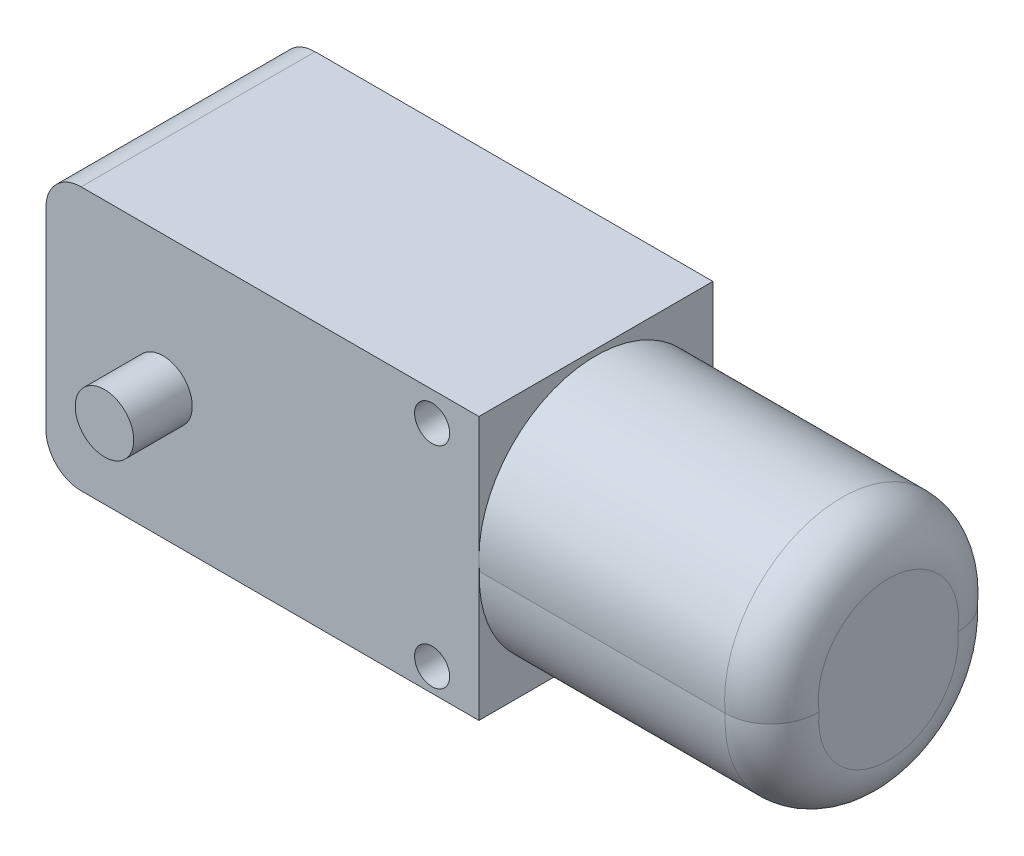
ISO-10303-21;
HEADER;
FILE_DESCRIPTION(('STEP AP214'),'2;1');
FILE_NAME('part.step','',(''),(''),'','','');
FILE_SCHEMA(('AUTOMOTIVE_DESIGN { 1 0 10303 214 1 1 1 1 }'));
ENDSEC;
DATA;
#1=APPLICATION_CONTEXT('core data for automotive mechanical design processes');
#2=APPLICATION_PROTOCOL_DEFINITION('international standard','automotive_design',2000,#1);
#3=PRODUCT_CONTEXT('',#1,'mechanical');
#4=PRODUCT('Part','Part','',(#3));
#5=PRODUCT_RELATED_PRODUCT_CATEGORY('part','',(#4));
#6=PRODUCT_DEFINITION_FORMATION('','',#4);
#7=PRODUCT_DEFINITION_CONTEXT('part definition',#1,'design');
#8=PRODUCT_DEFINITION('design','',#6,#7);
#9=PRODUCT_DEFINITION_SHAPE('','',#8);
#10=(LENGTH_UNIT() NAMED_UNIT(*) SI_UNIT(.MILLI.,.METRE.));
#11=(NAMED_UNIT(*) PLANE_ANGLE_UNIT() SI_UNIT($,.RADIAN.));
#12=(NAMED_UNIT(*) SI_UNIT($,.STERADIAN.) SOLID_ANGLE_UNIT());
#13=UNCERTAINTY_MEASURE_WITH_UNIT(LENGTH_MEASURE(1.E-05),#10,'distance_accuracy_value','');
#14=(GEOMETRIC_REPRESENTATION_CONTEXT(3) GLOBAL_UNCERTAINTY_ASSIGNED_CONTEXT((#13)) GLOBAL_UNIT_ASSIGNED_CONTEXT((#10,
#11,#12)) REPRESENTATION_CONTEXT('',''));
#15=CARTESIAN_POINT('',(0.,0.,0.));
#16=DIRECTION('',(0.,0.,1.));
#17=DIRECTION('',(1.,0.,0.));
#18=AXIS2_PLACEMENT_3D('',#15,#16,#17);
#19=CARTESIAN_POINT('',(-64.2641007815364,-2.5,-20.));
#20=DIRECTION('',(-1.,0.,0.));
#21=DIRECTION('',(0.,0.,1.));
#22=AXIS2_PLACEMENT_3D('',#19,#20,#21);
#23=PLANE('',#22);
#24=DIRECTION('',(0.,-1.,0.));
#25=VECTOR('',#24,1.);
#26=CARTESIAN_POINT('',(-64.2641007815364,-2.5,0.));
#27=LINE('',#26,#25);
#28=CARTESIAN_POINT('',(-64.2641007815364,-5.5,0.));
#29=VERTEX_POINT('',#28);
#30=CARTESIAN_POINT('',(-64.2641007815364,-22.,0.));
#31=VERTEX_POINT('',#30);
#32=EDGE_CURVE('E209',#29,#31,#27,.T.);
#33=ORIENTED_EDGE('',*,*,#32,.F.);
#34=DIRECTION('',(0.,0.,1.));
#35=VECTOR('',#34,1.);
#36=CARTESIAN_POINT('',(-64.2641007815364,-5.5,-20.));
#37=LINE('',#36,#35);
#38=CARTESIAN_POINT('',(-64.2641007815364,-5.5,-20.));
#39=VERTEX_POINT('',#38);
#40=EDGE_CURVE('E267',#29,#39,#37,.F.);
#41=ORIENTED_EDGE('',*,*,#40,.T.);
#42=DIRECTION('',(0.,-1.,0.));
#43=VECTOR('',#42,1.);
#44=CARTESIAN_POINT('',(-64.2641007815364,-2.5,-20.));
#45=LINE('',#44,#43);
#46=CARTESIAN_POINT('',(-64.2641007815364,-22.,-20.));
#47=VERTEX_POINT('',#46);
#48=EDGE_CURVE('E210',#39,#47,#45,.T.);
#49=ORIENTED_EDGE('',*,*,#48,.T.);
#50=DIRECTION('',(0.,0.,1.));
#51=VECTOR('',#50,1.);
#52=CARTESIAN_POINT('',(-64.2641007815364,-22.,-20.));
#53=LINE('',#52,#51);
#54=EDGE_CURVE('E263',#47,#31,#53,.T.);
#55=ORIENTED_EDGE('',*,*,#54,.T.);
#56=EDGE_LOOP('',(#33,#41,#49,#55));
#57=FACE_BOUND('',#56,.T.);
#58=DIRECTION('',(0.,0.,-1.));
#59=VECTOR('',#58,1.);
#60=CARTESIAN_POINT('',(-64.2641007815364,-11.25,-8.625));
#61=LINE('',#60,#59);
#62=CARTESIAN_POINT('',(-64.2641007815364,-11.25,-8.625));
#63=VERTEX_POINT('',#62);
#64=CARTESIAN_POINT('',(-64.2641007815364,-11.25,-11.375));
#65=VERTEX_POINT('',#64);
#66=EDGE_CURVE('E421',#63,#65,#61,.T.);
#67=ORIENTED_EDGE('',*,*,#66,.F.);
#68=DIRECTION('',(0.,1.,0.));
#69=VECTOR('',#68,1.);
#70=CARTESIAN_POINT('',(-64.2641007815364,-16.25,-8.625));
#71=LINE('',#70,#69);
#72=CARTESIAN_POINT('',(-64.2641007815364,-16.25,-8.625));
#73=VERTEX_POINT('',#72);
#74=EDGE_CURVE('E172',#73,#63,#71,.T.);
#75=ORIENTED_EDGE('',*,*,#74,.F.);
#76=DIRECTION('',(0.,0.,1.));
#77=VECTOR('',#76,1.);
#78=CARTESIAN_POINT('',(-64.2641007815364,-16.25,-8.625));
#79=LINE('',#78,#77);
#80=CARTESIAN_POINT('',(-64.2641007815364,-16.25,-11.375));
#81=VERTEX_POINT('',#80);
#82=EDGE_CURVE('E168',#81,#73,#79,.T.);
#83=ORIENTED_EDGE('',*,*,#82,.F.);
#84=DIRECTION('',(0.,-1.,0.));
#85=VECTOR('',#84,1.);
#86=CARTESIAN_POINT('',(-64.2641007815364,-16.25,-11.375));
#87=LINE('',#86,#85);
#88=EDGE_CURVE('E424',#65,#81,#87,.T.);
#89=ORIENTED_EDGE('',*,*,#88,.F.);
#90=EDGE_LOOP('',(#67,#75,#83,#89));
#91=FACE_BOUND('',#90,.T.);
#92=ADVANCED_FACE('F41',(#57,#91),#23,.T.);
#93=CARTESIAN_POINT('',(-27.2641007815364,-2.5,-20.));
#94=DIRECTION('',(1.,0.,0.));
#95=DIRECTION('',(0.,1.,0.));
#96=AXIS2_PLACEMENT_3D('',#93,#94,#95);
#97=PLANE('',#96);
#98=CARTESIAN_POINT('',(-27.2641007815364,-13.,-10.));
#99=DIRECTION('',(1.,0.,0.));
#100=DIRECTION('',(0.,1.,0.));
#101=AXIS2_PLACEMENT_3D('',#98,#99,#100);
#102=CIRCLE('',#101,10.);
#103=CARTESIAN_POINT('',(-27.2641007815364,-14.,-19.9498743710662));
#104=VERTEX_POINT('',#103);
#105=CARTESIAN_POINT('',(-27.2641007815364,-13.,-20.));
#106=VERTEX_POINT('',#105);
#107=EDGE_CURVE('E191',#104,#106,#102,.T.);
#108=ORIENTED_EDGE('',*,*,#107,.F.);
#109=CARTESIAN_POINT('',(-27.2641007815364,-14.5,-10.));
#110=DIRECTION('',(1.,0.,0.));
#111=DIRECTION('',(0.,1.,0.));
#112=AXIS2_PLACEMENT_3D('',#109,#110,#111);
#113=CIRCLE('',#112,9.96242942258564);
#114=CARTESIAN_POINT('',(-27.2641007815364,-14.,-0.050125628933799));
#115=VERTEX_POINT('',#114);
#116=EDGE_CURVE('E197',#115,#104,#113,.T.);
#117=ORIENTED_EDGE('',*,*,#116,.F.);
#118=CARTESIAN_POINT('',(-27.2641007815364,-13.,0.));
#119=VERTEX_POINT('',#118);
#120=EDGE_CURVE('E199',#119,#115,#102,.T.);
#121=ORIENTED_EDGE('',*,*,#120,.F.);
#122=DIRECTION('',(0.,1.,0.));
#123=VECTOR('',#122,1.);
#124=CARTESIAN_POINT('',(-27.2641007815364,-2.5,0.));
#125=LINE('',#124,#123);
#126=CARTESIAN_POINT('',(-27.2641007815364,-25.,0.));
#127=VERTEX_POINT('',#126);
#128=EDGE_CURVE('E235',#127,#119,#125,.T.);
#129=ORIENTED_EDGE('',*,*,#128,.F.);
#130=DIRECTION('',(0.,0.,1.));
#131=VECTOR('',#130,1.);
#132=CARTESIAN_POINT('',(-27.2641007815364,-25.,-20.));
#133=LINE('',#132,#131);
#134=CARTESIAN_POINT('',(-27.2641007815364,-25.,-20.));
#135=VERTEX_POINT('',#134);
#136=EDGE_CURVE('E227',#135,#127,#133,.T.);
#137=ORIENTED_EDGE('',*,*,#136,.F.);
#138=DIRECTION('',(0.,1.,0.));
#139=VECTOR('',#138,1.);
#140=CARTESIAN_POINT('',(-27.2641007815364,-2.5,-20.));
#141=LINE('',#140,#139);
#142=EDGE_CURVE('E219',#135,#106,#141,.T.);
#143=ORIENTED_EDGE('',*,*,#142,.T.);
#144=EDGE_LOOP('',(#108,#117,#121,#129,#137,#143));
#145=FACE_BOUND('',#144,.T.);
#146=ADVANCED_FACE('F313',(#145),#97,.T.);
#147=CARTESIAN_POINT('',(-64.2641007815364,-2.5,-20.));
#148=DIRECTION('',(0.,1.,0.));
#149=DIRECTION('',(0.,0.,1.));
#150=AXIS2_PLACEMENT_3D('',#147,#148,#149);
#151=PLANE('',#150);
#152=DIRECTION('',(-1.,0.,0.));
#153=VECTOR('',#152,1.);
#154=CARTESIAN_POINT('',(-64.2641007815364,-2.5,-20.));
#155=LINE('',#154,#153);
#156=CARTESIAN_POINT('',(-27.2641007815364,-2.5,-20.));
#157=VERTEX_POINT('',#156);
#158=CARTESIAN_POINT('',(-61.2641007815363,-2.5,-20.));
#159=VERTEX_POINT('',#158);
#160=EDGE_CURVE('E223',#157,#159,#155,.T.);
#161=ORIENTED_EDGE('',*,*,#160,.T.);
#162=DIRECTION('',(0.,0.,1.));
#163=VECTOR('',#162,1.);
#164=CARTESIAN_POINT('',(-61.2641007815363,-2.5,-20.));
#165=LINE('',#164,#163);
#166=CARTESIAN_POINT('',(-61.2641007815363,-2.5,0.));
#167=VERTEX_POINT('',#166);
#168=EDGE_CURVE('E253',#159,#167,#165,.T.);
#169=ORIENTED_EDGE('',*,*,#168,.T.);
#170=DIRECTION('',(-1.,0.,0.));
#171=VECTOR('',#170,1.);
#172=CARTESIAN_POINT('',(-64.2641007815364,-2.5,0.));
#173=LINE('',#172,#171);
#174=CARTESIAN_POINT('',(-27.2641007815364,-2.5,0.));
#175=VERTEX_POINT('',#174);
#176=EDGE_CURVE('E215',#175,#167,#173,.T.);
#177=ORIENTED_EDGE('',*,*,#176,.F.);
#178=DIRECTION('',(0.,0.,1.));
#179=VECTOR('',#178,1.);
#180=CARTESIAN_POINT('',(-27.2641007815364,-2.5,-20.));
#181=LINE('',#180,#179);
#182=EDGE_CURVE('E242',#157,#175,#181,.T.);
#183=ORIENTED_EDGE('',*,*,#182,.F.);
#184=EDGE_LOOP('',(#161,#169,#177,#183));
#185=FACE_BOUND('',#184,.T.);
#186=ADVANCED_FACE('F323',(#185),#151,.T.);
#187=EDGE_CURVE('E198',#106,#119,#102,.T.);
#188=ORIENTED_EDGE('',*,*,#187,.F.);
#189=EDGE_CURVE('E218',#106,#157,#141,.T.);
#190=ORIENTED_EDGE('',*,*,#189,.T.);
#191=ORIENTED_EDGE('',*,*,#182,.T.);
#192=EDGE_CURVE('E234',#119,#175,#125,.T.);
#193=ORIENTED_EDGE('',*,*,#192,.F.);
#194=EDGE_LOOP('',(#188,#190,#191,#193));
#195=FACE_BOUND('',#194,.T.);
#196=ADVANCED_FACE('F319',(#195),#97,.T.);
#197=CARTESIAN_POINT('',(-64.2641007815364,-25.,-20.));
#198=DIRECTION('',(0.,-1.,0.));
#199=DIRECTION('',(0.,0.,-1.));
#200=AXIS2_PLACEMENT_3D('',#197,#198,#199);
#201=PLANE('',#200);
#202=DIRECTION('',(1.,0.,0.));
#203=VECTOR('',#202,1.);
#204=CARTESIAN_POINT('',(-64.2641007815364,-25.,0.));
#205=LINE('',#204,#203);
#206=CARTESIAN_POINT('',(-61.2641007815363,-25.,0.));
#207=VERTEX_POINT('',#206);
#208=EDGE_CURVE('E231',#207,#127,#205,.T.);
#209=ORIENTED_EDGE('',*,*,#208,.F.);
#210=DIRECTION('',(0.,0.,1.));
#211=VECTOR('',#210,1.);
#212=CARTESIAN_POINT('',(-61.2641007815363,-25.,-20.));
#213=LINE('',#212,#211);
#214=CARTESIAN_POINT('',(-61.2641007815363,-25.,-20.));
#215=VERTEX_POINT('',#214);
#216=EDGE_CURVE('E275',#207,#215,#213,.F.);
#217=ORIENTED_EDGE('',*,*,#216,.T.);
#218=DIRECTION('',(1.,0.,0.));
#219=VECTOR('',#218,1.);
#220=CARTESIAN_POINT('',(-64.2641007815364,-25.,-20.));
#221=LINE('',#220,#219);
#222=EDGE_CURVE('E214',#215,#135,#221,.T.);
#223=ORIENTED_EDGE('',*,*,#222,.T.);
#224=ORIENTED_EDGE('',*,*,#136,.T.);
#225=EDGE_LOOP('',(#209,#217,#223,#224));
#226=FACE_BOUND('',#225,.T.);
#227=ADVANCED_FACE('F315',(#226),#201,.T.);
#228=CARTESIAN_POINT('',(0.,0.,-20.));
#229=DIRECTION('',(0.,0.,1.));
#230=DIRECTION('',(1.,0.,0.));
#231=AXIS2_PLACEMENT_3D('',#228,#229,#230);
#232=PLANE('',#231);
#233=CARTESIAN_POINT('',(-31.2641007815364,-23.,-20.));
#234=DIRECTION('',(0.,0.,-1.));
#235=DIRECTION('',(-1.,0.,0.));
#236=AXIS2_PLACEMENT_3D('',#233,#234,#235);
#237=CIRCLE('',#236,1.5);
#238=CARTESIAN_POINT('',(-32.7641007815364,-23.,-20.));
#239=VERTEX_POINT('',#238);
#240=EDGE_CURVE('E394',#239,#239,#237,.T.);
#241=ORIENTED_EDGE('',*,*,#240,.F.);
#242=EDGE_LOOP('',(#241));
#243=FACE_BOUND('',#242,.T.);
#244=CARTESIAN_POINT('',(-31.2641007815364,-4.99999999999999,-20.));
#245=DIRECTION('',(0.,0.,-1.));
#246=DIRECTION('',(-1.,0.,0.));
#247=AXIS2_PLACEMENT_3D('',#244,#245,#246);
#248=CIRCLE('',#247,1.5);
#249=CARTESIAN_POINT('',(-32.7641007815364,-4.99999999999999,-20.));
#250=VERTEX_POINT('',#249);
#251=EDGE_CURVE('E400',#250,#250,#248,.T.);
#252=ORIENTED_EDGE('',*,*,#251,.F.);
#253=EDGE_LOOP('',(#252));
#254=FACE_BOUND('',#253,.T.);
#255=CARTESIAN_POINT('',(-54.2641007815363,-14.,-20.));
#256=DIRECTION('',(0.,0.,1.));
#257=DIRECTION('',(1.,0.,0.));
#258=AXIS2_PLACEMENT_3D('',#255,#256,#257);
#259=CIRCLE('',#258,2.5);
#260=CARTESIAN_POINT('',(-51.7641007815363,-14.,-20.));
#261=VERTEX_POINT('',#260);
#262=EDGE_CURVE('E249',#261,#261,#259,.F.);
#263=ORIENTED_EDGE('',*,*,#262,.F.);
#264=EDGE_LOOP('',(#263));
#265=FACE_BOUND('',#264,.T.);
#266=ORIENTED_EDGE('',*,*,#48,.F.);
#267=CARTESIAN_POINT('',(-61.2641007815363,-5.5,-20.));
#268=DIRECTION('',(0.,0.,1.));
#269=DIRECTION('',(1.,0.,0.));
#270=AXIS2_PLACEMENT_3D('',#267,#268,#269);
#271=CIRCLE('',#270,3.);
#272=EDGE_CURVE('E272',#39,#159,#271,.F.);
#273=ORIENTED_EDGE('',*,*,#272,.T.);
#274=ORIENTED_EDGE('',*,*,#160,.F.);
#275=ORIENTED_EDGE('',*,*,#189,.F.);
#276=ORIENTED_EDGE('',*,*,#142,.F.);
#277=ORIENTED_EDGE('',*,*,#222,.F.);
#278=CARTESIAN_POINT('',(-61.2641007815363,-22.,-20.));
#279=DIRECTION('',(0.,0.,1.));
#280=DIRECTION('',(1.,0.,0.));
#281=AXIS2_PLACEMENT_3D('',#278,#279,#280);
#282=CIRCLE('',#281,3.);
#283=EDGE_CURVE('E270',#215,#47,#282,.F.);
#284=ORIENTED_EDGE('',*,*,#283,.T.);
#285=EDGE_LOOP('',(#266,#273,#274,#275,#276,#277,#284));
#286=FACE_BOUND('',#285,.T.);
#287=ADVANCED_FACE('F318',(#243,#254,#265,#286),#232,.F.);
#288=CARTESIAN_POINT('',(0.,0.,0.));
#289=DIRECTION('',(0.,0.,1.));
#290=DIRECTION('',(1.,0.,0.));
#291=AXIS2_PLACEMENT_3D('',#288,#289,#290);
#292=PLANE('',#291);
#293=CARTESIAN_POINT('',(-31.2641007815364,-23.,0.));
#294=DIRECTION('',(0.,0.,1.));
#295=DIRECTION('',(1.,0.,0.));
#296=AXIS2_PLACEMENT_3D('',#293,#294,#295);
#297=CIRCLE('',#296,1.5);
#298=CARTESIAN_POINT('',(-29.7641007815363,-23.,0.));
#299=VERTEX_POINT('',#298);
#300=EDGE_CURVE('E46',#299,#299,#297,.T.);
#301=ORIENTED_EDGE('',*,*,#300,.F.);
#302=EDGE_LOOP('',(#301));
#303=FACE_BOUND('',#302,.T.);
#304=CARTESIAN_POINT('',(-31.2641007815364,-4.99999999999999,0.));
#305=DIRECTION('',(0.,0.,1.));
#306=DIRECTION('',(1.,0.,0.));
#307=AXIS2_PLACEMENT_3D('',#304,#305,#306);
#308=CIRCLE('',#307,1.5);
#309=CARTESIAN_POINT('',(-29.7641007815364,-4.99999999999999,0.));
#310=VERTEX_POINT('',#309);
#311=EDGE_CURVE('E405',#310,#310,#308,.T.);
#312=ORIENTED_EDGE('',*,*,#311,.F.);
#313=EDGE_LOOP('',(#312));
#314=FACE_BOUND('',#313,.T.);
#315=CARTESIAN_POINT('',(-54.2641007815363,-14.,0.));
#316=DIRECTION('',(0.,0.,1.));
#317=DIRECTION('',(1.,0.,0.));
#318=AXIS2_PLACEMENT_3D('',#315,#316,#317);
#319=CIRCLE('',#318,2.5);
#320=CARTESIAN_POINT('',(-51.7641007815363,-14.,0.));
#321=VERTEX_POINT('',#320);
#322=EDGE_CURVE('E186',#321,#321,#319,.T.);
#323=ORIENTED_EDGE('',*,*,#322,.F.);
#324=EDGE_LOOP('',(#323));
#325=FACE_BOUND('',#324,.T.);
#326=ORIENTED_EDGE('',*,*,#176,.T.);
#327=CARTESIAN_POINT('',(-61.2641007815363,-5.5,0.));
#328=DIRECTION('',(0.,0.,1.));
#329=DIRECTION('',(1.,0.,0.));
#330=AXIS2_PLACEMENT_3D('',#327,#328,#329);
#331=CIRCLE('',#330,3.);
#332=EDGE_CURVE('E260',#167,#29,#331,.T.);
#333=ORIENTED_EDGE('',*,*,#332,.T.);
#334=ORIENTED_EDGE('',*,*,#32,.T.);
#335=CARTESIAN_POINT('',(-61.2641007815363,-22.,0.));
#336=DIRECTION('',(0.,0.,1.));
#337=DIRECTION('',(1.,0.,0.));
#338=AXIS2_PLACEMENT_3D('',#335,#336,#337);
#339=CIRCLE('',#338,3.);
#340=EDGE_CURVE('E257',#31,#207,#339,.T.);
#341=ORIENTED_EDGE('',*,*,#340,.T.);
#342=ORIENTED_EDGE('',*,*,#208,.T.);
#343=ORIENTED_EDGE('',*,*,#128,.T.);
#344=ORIENTED_EDGE('',*,*,#192,.T.);
#345=EDGE_LOOP('',(#326,#333,#334,#341,#342,#343,#344));
#346=FACE_BOUND('',#345,.T.);
#347=ADVANCED_FACE('F328',(#303,#314,#325,#346),#292,.T.);
#348=CARTESIAN_POINT('',(-2.26410078153636,-13.,-10.));
#349=DIRECTION('',(-1.,0.,0.));
#350=DIRECTION('',(0.,-1.,0.));
#351=AXIS2_PLACEMENT_3D('',#348,#349,#350);
#352=CYLINDRICAL_SURFACE('',#351,10.);
#353=DIRECTION('',(-1.,0.,0.));
#354=VECTOR('',#353,1.);
#355=CARTESIAN_POINT('',(-2.26410078153636,-14.,-0.050125628933799));
#356=LINE('',#355,#354);
#357=CARTESIAN_POINT('',(-6.26410078153636,-14.,-0.050125628933799));
#358=VERTEX_POINT('',#357);
#359=EDGE_CURVE('E206',#358,#115,#356,.T.);
#360=ORIENTED_EDGE('',*,*,#359,.F.);
#361=CARTESIAN_POINT('',(-6.26410078153636,-13.,-10.));
#362=DIRECTION('',(1.,0.,0.));
#363=DIRECTION('',(0.,1.,0.));
#364=AXIS2_PLACEMENT_3D('',#361,#362,#363);
#365=CIRCLE('',#364,10.);
#366=CARTESIAN_POINT('',(-6.26410078153636,-14.,-19.9498743710662));
#367=VERTEX_POINT('',#366);
#368=EDGE_CURVE('E52',#358,#367,#365,.F.);
#369=ORIENTED_EDGE('',*,*,#368,.T.);
#370=DIRECTION('',(-1.,0.,0.));
#371=VECTOR('',#370,1.);
#372=CARTESIAN_POINT('',(-2.26410078153636,-14.,-19.9498743710662));
#373=LINE('',#372,#371);
#374=EDGE_CURVE('E203',#367,#104,#373,.T.);
#375=ORIENTED_EDGE('',*,*,#374,.T.);
#376=ORIENTED_EDGE('',*,*,#107,.T.);
#377=ORIENTED_EDGE('',*,*,#187,.T.);
#378=ORIENTED_EDGE('',*,*,#120,.T.);
#379=EDGE_LOOP('',(#360,#369,#375,#376,#377,#378));
#380=FACE_BOUND('',#379,.T.);
#381=ADVANCED_FACE('F331',(#380),#352,.T.);
#382=CARTESIAN_POINT('',(-2.26410078153636,-14.5,-10.));
#383=DIRECTION('',(-1.,0.,0.));
#384=DIRECTION('',(0.,-1.,0.));
#385=AXIS2_PLACEMENT_3D('',#382,#383,#384);
#386=CYLINDRICAL_SURFACE('',#385,9.96242942258564);
#387=ORIENTED_EDGE('',*,*,#374,.F.);
#388=CARTESIAN_POINT('',(-6.26410078153636,-14.5,-10.));
#389=DIRECTION('',(1.,0.,0.));
#390=DIRECTION('',(0.,1.,0.));
#391=AXIS2_PLACEMENT_3D('',#388,#389,#390);
#392=CIRCLE('',#391,9.96242942258564);
#393=EDGE_CURVE('E11',#367,#358,#392,.F.);
#394=ORIENTED_EDGE('',*,*,#393,.T.);
#395=ORIENTED_EDGE('',*,*,#359,.T.);
#396=ORIENTED_EDGE('',*,*,#116,.T.);
#397=EDGE_LOOP('',(#387,#394,#395,#396));
#398=FACE_BOUND('',#397,.T.);
#399=ADVANCED_FACE('F338',(#398),#386,.T.);
#400=CARTESIAN_POINT('',(-2.26410078153636,-13.75,-10.));
#401=DIRECTION('',(1.,0.,0.));
#402=DIRECTION('',(0.,1.,0.));
#403=AXIS2_PLACEMENT_3D('',#400,#401,#402);
#404=PLANE('',#403);
#405=CARTESIAN_POINT('',(-2.26410078153636,-14.5,-10.));
#406=DIRECTION('',(1.,0.,0.));
#407=DIRECTION('',(0.,1.,0.));
#408=AXIS2_PLACEMENT_3D('',#405,#406,#407);
#409=CIRCLE('',#408,5.96242942258564);
#410=CARTESIAN_POINT('',(-2.26410078153636,-13.8998117935617,-4.06785546904264));
#411=VERTEX_POINT('',#410);
#412=CARTESIAN_POINT('',(-2.26410078153636,-13.8998117935617,-15.9321445309574));
#413=VERTEX_POINT('',#412);
#414=EDGE_CURVE('E278',#411,#413,#409,.T.);
#415=ORIENTED_EDGE('',*,*,#414,.T.);
#416=CARTESIAN_POINT('',(-2.26410078153636,-13.,-10.));
#417=DIRECTION('',(1.,0.,0.));
#418=DIRECTION('',(0.,1.,0.));
#419=AXIS2_PLACEMENT_3D('',#416,#417,#418);
#420=CIRCLE('',#419,6.00000000000001);
#421=EDGE_CURVE('E281',#413,#411,#420,.T.);
#422=ORIENTED_EDGE('',*,*,#421,.T.);
#423=EDGE_LOOP('',(#415,#422));
#424=FACE_BOUND('',#423,.T.);
#425=ADVANCED_FACE('F342',(#424),#404,.T.);
#426=CARTESIAN_POINT('',(-54.2641007815363,-14.,5.));
#427=DIRECTION('',(0.,0.,-1.));
#428=DIRECTION('',(-1.,0.,0.));
#429=AXIS2_PLACEMENT_3D('',#426,#427,#428);
#430=CYLINDRICAL_SURFACE('',#429,2.5);
#431=CARTESIAN_POINT('',(-54.2641007815363,-14.,5.));
#432=DIRECTION('',(0.,0.,1.));
#433=DIRECTION('',(1.,0.,0.));
#434=AXIS2_PLACEMENT_3D('',#431,#432,#433);
#435=CIRCLE('',#434,2.5);
#436=CARTESIAN_POINT('',(-51.7641007815363,-14.,5.));
#437=VERTEX_POINT('',#436);
#438=EDGE_CURVE('E187',#437,#437,#435,.T.);
#439=ORIENTED_EDGE('',*,*,#438,.F.);
#440=EDGE_LOOP('',(#439));
#441=FACE_BOUND('',#440,.T.);
#442=ORIENTED_EDGE('',*,*,#322,.T.);
#443=EDGE_LOOP('',(#442));
#444=FACE_BOUND('',#443,.T.);
#445=ADVANCED_FACE('F346',(#441,#444),#430,.T.);
#446=CARTESIAN_POINT('',(-54.2641007815363,-14.,5.));
#447=DIRECTION('',(0.,0.,1.));
#448=DIRECTION('',(1.,0.,0.));
#449=AXIS2_PLACEMENT_3D('',#446,#447,#448);
#450=PLANE('',#449);
#451=ORIENTED_EDGE('',*,*,#438,.T.);
#452=EDGE_LOOP('',(#451));
#453=FACE_BOUND('',#452,.T.);
#454=ADVANCED_FACE('F350',(#453),#450,.T.);
#455=CARTESIAN_POINT('',(-54.2641007815363,-14.,-25.));
#456=DIRECTION('',(0.,0.,1.));
#457=DIRECTION('',(1.,0.,0.));
#458=AXIS2_PLACEMENT_3D('',#455,#456,#457);
#459=CYLINDRICAL_SURFACE('',#458,2.5);
#460=CARTESIAN_POINT('',(-54.2641007815363,-14.,-25.));
#461=DIRECTION('',(0.,0.,-1.));
#462=DIRECTION('',(-1.,0.,0.));
#463=AXIS2_PLACEMENT_3D('',#460,#461,#462);
#464=CIRCLE('',#463,2.5);
#465=CARTESIAN_POINT('',(-56.7641007815364,-14.,-25.));
#466=VERTEX_POINT('',#465);
#467=EDGE_CURVE('E182',#466,#466,#464,.T.);
#468=ORIENTED_EDGE('',*,*,#467,.F.);
#469=EDGE_LOOP('',(#468));
#470=FACE_BOUND('',#469,.T.);
#471=ORIENTED_EDGE('',*,*,#262,.T.);
#472=EDGE_LOOP('',(#471));
#473=FACE_BOUND('',#472,.T.);
#474=ADVANCED_FACE('F354',(#470,#473),#459,.T.);
#475=CARTESIAN_POINT('',(-54.2641007815363,-14.,-25.));
#476=DIRECTION('',(0.,0.,-1.));
#477=DIRECTION('',(-1.,0.,0.));
#478=AXIS2_PLACEMENT_3D('',#475,#476,#477);
#479=PLANE('',#478);
#480=ORIENTED_EDGE('',*,*,#467,.T.);
#481=EDGE_LOOP('',(#480));
#482=FACE_BOUND('',#481,.T.);
#483=ADVANCED_FACE('F309',(#482),#479,.T.);
#484=CARTESIAN_POINT('',(-61.2641007815363,-5.5,-20.));
#485=DIRECTION('',(0.,0.,1.));
#486=DIRECTION('',(1.,0.,0.));
#487=AXIS2_PLACEMENT_3D('',#484,#485,#486);
#488=CYLINDRICAL_SURFACE('',#487,3.);
#489=ORIENTED_EDGE('',*,*,#272,.F.);
#490=ORIENTED_EDGE('',*,*,#40,.F.);
#491=ORIENTED_EDGE('',*,*,#332,.F.);
#492=ORIENTED_EDGE('',*,*,#168,.F.);
#493=EDGE_LOOP('',(#489,#490,#491,#492));
#494=FACE_BOUND('',#493,.T.);
#495=ADVANCED_FACE('F305',(#494),#488,.T.);
#496=CARTESIAN_POINT('',(-61.2641007815363,-22.,-20.));
#497=DIRECTION('',(0.,0.,1.));
#498=DIRECTION('',(1.,0.,0.));
#499=AXIS2_PLACEMENT_3D('',#496,#497,#498);
#500=CYLINDRICAL_SURFACE('',#499,3.);
#501=ORIENTED_EDGE('',*,*,#283,.F.);
#502=ORIENTED_EDGE('',*,*,#216,.F.);
#503=ORIENTED_EDGE('',*,*,#340,.F.);
#504=ORIENTED_EDGE('',*,*,#54,.F.);
#505=EDGE_LOOP('',(#501,#502,#503,#504));
#506=FACE_BOUND('',#505,.T.);
#507=ADVANCED_FACE('F300',(#506),#500,.T.);
#508=CARTESIAN_POINT('',(-6.26410078153636,-14.5,-10.));
#509=DIRECTION('',(1.,0.,0.));
#510=DIRECTION('',(0.,1.,0.));
#511=AXIS2_PLACEMENT_3D('',#508,#509,#510);
#512=TOROIDAL_SURFACE('',#511,5.96242942258564,4.);
#513=CARTESIAN_POINT('',(-6.26410078153636,-14.,-0.0501256289337972));
#514=CARTESIAN_POINT('',(-6.15185902546831,-14.000000274041,-0.0501147425256198));
#515=CARTESIAN_POINT('',(-6.03962243514195,-13.9998816706764,-0.0548618209978833));
#516=CARTESIAN_POINT('',(-5.815953370965,-13.9994088280504,-0.0737876869232872));
#517=CARTESIAN_POINT('',(-5.70452085610091,-13.9990546008945,-0.0879659898306335));
#518=CARTESIAN_POINT('',(-5.48332479571403,-13.9981129815083,-0.125655997962684));
#519=CARTESIAN_POINT('',(-5.3735600640966,-13.9975257638918,-0.149160713542755));
#520=CARTESIAN_POINT('',(-5.15642855298614,-13.9961230023291,-0.20531106937798));
#521=CARTESIAN_POINT('',(-5.04906174581178,-13.99530746102,-0.237956604053743));
#522=CARTESIAN_POINT('',(-4.73159871379289,-13.9925251282304,-0.349335479338677));
#523=CARTESIAN_POINT('',(-4.52604457629031,-13.9902222198653,-0.441527420558998));
#524=CARTESIAN_POINT('',(-4.13347860753174,-13.9847903439029,-0.659007607916585));
#525=CARTESIAN_POINT('',(-3.94646280497822,-13.9816615537551,-0.784288744495021));
#526=CARTESIAN_POINT('',(-3.59589185790122,-13.9746639843926,-1.06452948481339));
#527=CARTESIAN_POINT('',(-3.43235672688429,-13.9707945803996,-1.21951414645238));
#528=CARTESIAN_POINT('',(-3.13351486852415,-13.962427785588,-1.55471533493232));
#529=CARTESIAN_POINT('',(-2.99821659172907,-13.9579302074436,-1.7349393883715));
#530=CARTESIAN_POINT('',(-2.75931111989228,-13.9484243188543,-2.11597355100318));
#531=CARTESIAN_POINT('',(-2.65579536140018,-13.9434145890847,-2.31684087743359));
#532=CARTESIAN_POINT('',(-2.48386016474512,-13.9330401401763,-2.73298703883004));
#533=CARTESIAN_POINT('',(-2.41541665101331,-13.9276756674168,-2.94825587271769));
#534=CARTESIAN_POINT('',(-2.33262323572276,-13.9186388626452,-3.31110103393218));
#535=CARTESIAN_POINT('',(-2.3077552029003,-13.9150219314222,-3.45638142459727));
#536=CARTESIAN_POINT('',(-2.27400606240202,-13.9077493433409,-3.748634106835));
#537=CARTESIAN_POINT('',(-2.26509821963306,-13.9040937615814,-3.8956031532046));
#538=CARTESIAN_POINT('',(-2.26412709770861,-13.9002319599955,-4.05095251654191));
#539=CARTESIAN_POINT('',(-2.26410071169739,-13.9000218678504,-4.05940421007925));
#540=CARTESIAN_POINT('',(-2.26410078153636,-13.8998117935617,-4.06785546904264));
#541=B_SPLINE_CURVE_WITH_KNOTS('',3,(#513,#514,#515,#516,#517,#518,#519,#520,#521,#522,#523,
#524,#525,#526,#527,#528,#529,#530,#531,#532,#533,#534,#535,#536,#537,#538,#539,#540),
.UNSPECIFIED.,.F.,.F.,(4,2,2,2,2,2,2,2,2,2,2,2,2,4),(0.,0.336615555791165,0.673213818699897,
1.00956029434609,1.34590288524294,2.01830164594818,2.69055605212652,3.36338008855914,
4.03640519570355,4.71134879771961,5.38582845757267,5.82738358676229,6.26819836802391,
6.29356120706971),.UNSPECIFIED.);
#542=EDGE_CURVE('E174',#358,#411,#541,.T.);
#543=ORIENTED_EDGE('',*,*,#542,.F.);
#544=ORIENTED_EDGE('',*,*,#393,.F.);
#545=CARTESIAN_POINT('',(-6.26410078153636,-14.,-19.9498743710662));
#546=CARTESIAN_POINT('',(-6.15185902546831,-14.000000274041,-19.9498852574744));
#547=CARTESIAN_POINT('',(-6.03962243514195,-13.9998816706764,-19.9451381790021));
#548=CARTESIAN_POINT('',(-5.815953370965,-13.9994088280504,-19.9262123130767));
#549=CARTESIAN_POINT('',(-5.70452085610091,-13.9990546008945,-19.9120340101694));
#550=CARTESIAN_POINT('',(-5.48332479571402,-13.9981129815083,-19.8743440020373));
#551=CARTESIAN_POINT('',(-5.3735600640966,-13.9975257638918,-19.8508392864572));
#552=CARTESIAN_POINT('',(-5.15642855298614,-13.996123002329,-19.794688930622));
#553=CARTESIAN_POINT('',(-5.04906174581178,-13.99530746102,-19.7620433959463));
#554=CARTESIAN_POINT('',(-4.73159871379289,-13.9925251282304,-19.6506645206613));
#555=CARTESIAN_POINT('',(-4.52604457629031,-13.9902222198653,-19.558472579441));
#556=CARTESIAN_POINT('',(-4.13347860753174,-13.9847903439029,-19.3409923920834));
#557=CARTESIAN_POINT('',(-3.94646280497822,-13.981661553755,-19.215711255505));
#558=CARTESIAN_POINT('',(-3.59589185790122,-13.9746639843926,-18.9354705151866));
#559=CARTESIAN_POINT('',(-3.43235672688429,-13.9707945803996,-18.7804858535476));
#560=CARTESIAN_POINT('',(-3.13351486852415,-13.962427785588,-18.4452846650677));
#561=CARTESIAN_POINT('',(-2.99821659172907,-13.9579302074436,-18.2650606116285));
#562=CARTESIAN_POINT('',(-2.75931111989228,-13.9484243188542,-17.8840264489968));
#563=CARTESIAN_POINT('',(-2.65579536140018,-13.9434145890847,-17.6831591225664));
#564=CARTESIAN_POINT('',(-2.48386016474512,-13.9330401401763,-17.26701296117));
#565=CARTESIAN_POINT('',(-2.41541665101331,-13.9276756674168,-17.0517441272823));
#566=CARTESIAN_POINT('',(-2.33262323572276,-13.9186388626452,-16.6888989660678));
#567=CARTESIAN_POINT('',(-2.3077552029003,-13.9150219314221,-16.5436185754027));
#568=CARTESIAN_POINT('',(-2.27400606240202,-13.9077493433409,-16.251365893165));
#569=CARTESIAN_POINT('',(-2.26509821963306,-13.9040937615815,-16.1043968467954));
#570=CARTESIAN_POINT('',(-2.26412709770861,-13.9002319599955,-15.9490474834581));
#571=CARTESIAN_POINT('',(-2.26410071169739,-13.9000218678504,-15.9405957899207));
#572=CARTESIAN_POINT('',(-2.26410078153636,-13.8998117935617,-15.9321445309574));
#573=B_SPLINE_CURVE_WITH_KNOTS('',3,(#545,#546,#547,#548,#549,#550,#551,#552,#553,#554,#555,
#556,#557,#558,#559,#560,#561,#562,#563,#564,#565,#566,#567,#568,#569,#570,#571,#572),
.UNSPECIFIED.,.F.,.F.,(4,2,2,2,2,2,2,2,2,2,2,2,2,4),(0.,0.336615555791165,0.673213818699898,
1.00956029434609,1.34590288524294,2.01830164594818,2.69055605212653,3.36338008855914,
4.03640519570354,4.71134879771961,5.38582845757268,5.82738358676229,6.26819836802391,
6.2935612070697),.UNSPECIFIED.);
#574=EDGE_CURVE('E68',#413,#367,#573,.F.);
#575=ORIENTED_EDGE('',*,*,#574,.F.);
#576=ORIENTED_EDGE('',*,*,#414,.F.);
#577=EDGE_LOOP('',(#543,#544,#575,#576));
#578=FACE_BOUND('',#577,.T.);
#579=ADVANCED_FACE('F296',(#578),#512,.T.);
#580=CARTESIAN_POINT('',(-6.26410078153636,-13.,-10.));
#581=DIRECTION('',(1.,0.,0.));
#582=DIRECTION('',(0.,1.,0.));
#583=AXIS2_PLACEMENT_3D('',#580,#581,#582);
#584=TOROIDAL_SURFACE('',#583,6.00000000000001,4.);
#585=ORIENTED_EDGE('',*,*,#574,.T.);
#586=ORIENTED_EDGE('',*,*,#368,.F.);
#587=ORIENTED_EDGE('',*,*,#542,.T.);
#588=ORIENTED_EDGE('',*,*,#421,.F.);
#589=EDGE_LOOP('',(#585,#586,#587,#588));
#590=FACE_BOUND('',#589,.T.);
#591=ADVANCED_FACE('F43',(#590),#584,.T.);
#592=CARTESIAN_POINT('',(-69.2641007815364,-16.25,-8.625));
#593=DIRECTION('',(0.,0.,-1.));
#594=DIRECTION('',(0.,1.,0.));
#595=AXIS2_PLACEMENT_3D('',#592,#593,#594);
#596=PLANE('',#595);
#597=CARTESIAN_POINT('',(-66.7641007815364,-13.75,-8.625));
#598=DIRECTION('',(0.,0.,-1.));
#599=DIRECTION('',(0.,1.,0.));
#600=AXIS2_PLACEMENT_3D('',#597,#598,#599);
#601=CIRCLE('',#600,1.5);
#602=CARTESIAN_POINT('',(-66.7641007815364,-12.25,-8.625));
#603=VERTEX_POINT('',#602);
#604=EDGE_CURVE('E410',#603,#603,#601,.F.);
#605=ORIENTED_EDGE('',*,*,#604,.F.);
#606=EDGE_LOOP('',(#605));
#607=FACE_BOUND('',#606,.T.);
#608=ORIENTED_EDGE('',*,*,#74,.T.);
#609=DIRECTION('',(1.,0.,0.));
#610=VECTOR('',#609,1.);
#611=CARTESIAN_POINT('',(-69.2641007815364,-11.25,-8.625));
#612=LINE('',#611,#610);
#613=CARTESIAN_POINT('',(-69.2641007815364,-11.25,-8.625));
#614=VERTEX_POINT('',#613);
#615=EDGE_CURVE('E151',#614,#63,#612,.T.);
#616=ORIENTED_EDGE('',*,*,#615,.F.);
#617=DIRECTION('',(0.,1.,0.));
#618=VECTOR('',#617,1.);
#619=CARTESIAN_POINT('',(-69.2641007815364,-16.25,-8.625));
#620=LINE('',#619,#618);
#621=CARTESIAN_POINT('',(-69.2641007815364,-16.25,-8.625));
#622=VERTEX_POINT('',#621);
#623=EDGE_CURVE('E159',#622,#614,#620,.T.);
#624=ORIENTED_EDGE('',*,*,#623,.F.);
#625=DIRECTION('',(1.,0.,0.));
#626=VECTOR('',#625,1.);
#627=CARTESIAN_POINT('',(-69.2641007815364,-16.25,-8.625));
#628=LINE('',#627,#626);
#629=EDGE_CURVE('E418',#622,#73,#628,.T.);
#630=ORIENTED_EDGE('',*,*,#629,.T.);
#631=EDGE_LOOP('',(#608,#616,#624,#630));
#632=FACE_BOUND('',#631,.T.);
#633=ADVANCED_FACE('F170',(#607,#632),#596,.F.);
#634=CARTESIAN_POINT('',(-69.2641007815364,-11.25,-8.625));
#635=DIRECTION('',(0.,-1.,0.));
#636=DIRECTION('',(0.,0.,-1.));
#637=AXIS2_PLACEMENT_3D('',#634,#635,#636);
#638=PLANE('',#637);
#639=ORIENTED_EDGE('',*,*,#66,.T.);
#640=DIRECTION('',(1.,0.,0.));
#641=VECTOR('',#640,1.);
#642=CARTESIAN_POINT('',(-69.2641007815364,-11.25,-11.375));
#643=LINE('',#642,#641);
#644=CARTESIAN_POINT('',(-69.2641007815364,-11.25,-11.375));
#645=VERTEX_POINT('',#644);
#646=EDGE_CURVE('E154',#645,#65,#643,.T.);
#647=ORIENTED_EDGE('',*,*,#646,.F.);
#648=DIRECTION('',(0.,0.,-1.));
#649=VECTOR('',#648,1.);
#650=CARTESIAN_POINT('',(-69.2641007815364,-11.25,-8.625));
#651=LINE('',#650,#649);
#652=EDGE_CURVE('E147',#614,#645,#651,.T.);
#653=ORIENTED_EDGE('',*,*,#652,.F.);
#654=ORIENTED_EDGE('',*,*,#615,.T.);
#655=EDGE_LOOP('',(#639,#647,#653,#654));
#656=FACE_BOUND('',#655,.T.);
#657=ADVANCED_FACE('F149',(#656),#638,.F.);
#658=CARTESIAN_POINT('',(-69.2641007815364,-16.25,-11.375));
#659=DIRECTION('',(0.,0.,1.));
#660=DIRECTION('',(1.,0.,0.));
#661=AXIS2_PLACEMENT_3D('',#658,#659,#660);
#662=PLANE('',#661);
#663=CARTESIAN_POINT('',(-66.7641007815364,-13.75,-11.375));
#664=DIRECTION('',(0.,0.,-1.));
#665=DIRECTION('',(-1.,0.,0.));
#666=AXIS2_PLACEMENT_3D('',#663,#664,#665);
#667=CIRCLE('',#666,1.5);
#668=CARTESIAN_POINT('',(-68.2641007815364,-13.75,-11.375));
#669=VERTEX_POINT('',#668);
#670=EDGE_CURVE('E406',#669,#669,#667,.T.);
#671=ORIENTED_EDGE('',*,*,#670,.F.);
#672=EDGE_LOOP('',(#671));
#673=FACE_BOUND('',#672,.T.);
#674=ORIENTED_EDGE('',*,*,#88,.T.);
#675=DIRECTION('',(1.,0.,0.));
#676=VECTOR('',#675,1.);
#677=CARTESIAN_POINT('',(-69.2641007815364,-16.25,-11.375));
#678=LINE('',#677,#676);
#679=CARTESIAN_POINT('',(-69.2641007815364,-16.25,-11.375));
#680=VERTEX_POINT('',#679);
#681=EDGE_CURVE('E60',#680,#81,#678,.T.);
#682=ORIENTED_EDGE('',*,*,#681,.F.);
#683=DIRECTION('',(0.,-1.,0.));
#684=VECTOR('',#683,1.);
#685=CARTESIAN_POINT('',(-69.2641007815364,-16.25,-11.375));
#686=LINE('',#685,#684);
#687=EDGE_CURVE('E158',#645,#680,#686,.T.);
#688=ORIENTED_EDGE('',*,*,#687,.F.);
#689=ORIENTED_EDGE('',*,*,#646,.T.);
#690=EDGE_LOOP('',(#674,#682,#688,#689));
#691=FACE_BOUND('',#690,.T.);
#692=ADVANCED_FACE('F367',(#673,#691),#662,.F.);
#693=CARTESIAN_POINT('',(-69.2641007815364,-16.25,-8.625));
#694=DIRECTION('',(0.,1.,0.));
#695=DIRECTION('',(0.,0.,1.));
#696=AXIS2_PLACEMENT_3D('',#693,#694,#695);
#697=PLANE('',#696);
#698=ORIENTED_EDGE('',*,*,#82,.T.);
#699=ORIENTED_EDGE('',*,*,#629,.F.);
#700=DIRECTION('',(0.,0.,1.));
#701=VECTOR('',#700,1.);
#702=CARTESIAN_POINT('',(-69.2641007815364,-16.25,-8.625));
#703=LINE('',#702,#701);
#704=EDGE_CURVE('E163',#680,#622,#703,.T.);
#705=ORIENTED_EDGE('',*,*,#704,.F.);
#706=ORIENTED_EDGE('',*,*,#681,.T.);
#707=EDGE_LOOP('',(#698,#699,#705,#706));
#708=FACE_BOUND('',#707,.T.);
#709=ADVANCED_FACE('F370',(#708),#697,.F.);
#710=CARTESIAN_POINT('',(-69.2641007815364,0.,0.));
#711=DIRECTION('',(-1.,0.,0.));
#712=DIRECTION('',(0.,0.,1.));
#713=AXIS2_PLACEMENT_3D('',#710,#711,#712);
#714=PLANE('',#713);
#715=ORIENTED_EDGE('',*,*,#623,.T.);
#716=ORIENTED_EDGE('',*,*,#652,.T.);
#717=ORIENTED_EDGE('',*,*,#687,.T.);
#718=ORIENTED_EDGE('',*,*,#704,.T.);
#719=EDGE_LOOP('',(#715,#716,#717,#718));
#720=FACE_BOUND('',#719,.T.);
#721=ADVANCED_FACE('F162',(#720),#714,.T.);
#722=CARTESIAN_POINT('',(-66.7641007815364,-13.75,-4.38235931288072));
#723=DIRECTION('',(0.,0.,-1.));
#724=DIRECTION('',(-1.,0.,0.));
#725=AXIS2_PLACEMENT_3D('',#722,#723,#724);
#726=CYLINDRICAL_SURFACE('',#725,1.5);
#727=ORIENTED_EDGE('',*,*,#604,.T.);
#728=EDGE_LOOP('',(#727));
#729=FACE_BOUND('',#728,.T.);
#730=ORIENTED_EDGE('',*,*,#670,.T.);
#731=EDGE_LOOP('',(#730));
#732=FACE_BOUND('',#731,.T.);
#733=ADVANCED_FACE('F376',(#729,#732),#726,.F.);
#734=CARTESIAN_POINT('',(-31.2641007815364,-4.99999999999999,5.));
#735=DIRECTION('',(0.,0.,-1.));
#736=DIRECTION('',(-1.,0.,0.));
#737=AXIS2_PLACEMENT_3D('',#734,#735,#736);
#738=CYLINDRICAL_SURFACE('',#737,1.5);
#739=ORIENTED_EDGE('',*,*,#311,.T.);
#740=EDGE_LOOP('',(#739));
#741=FACE_BOUND('',#740,.T.);
#742=ORIENTED_EDGE('',*,*,#251,.T.);
#743=EDGE_LOOP('',(#742));
#744=FACE_BOUND('',#743,.T.);
#745=ADVANCED_FACE('F379',(#741,#744),#738,.F.);
#746=CARTESIAN_POINT('',(-31.2641007815364,-23.,5.));
#747=DIRECTION('',(0.,0.,-1.));
#748=DIRECTION('',(-1.,0.,0.));
#749=AXIS2_PLACEMENT_3D('',#746,#747,#748);
#750=CYLINDRICAL_SURFACE('',#749,1.5);
#751=ORIENTED_EDGE('',*,*,#300,.T.);
#752=EDGE_LOOP('',(#751));
#753=FACE_BOUND('',#752,.T.);
#754=ORIENTED_EDGE('',*,*,#240,.T.);
#755=EDGE_LOOP('',(#754));
#756=FACE_BOUND('',#755,.T.);
#757=ADVANCED_FACE('F383',(#753,#756),#750,.F.);
#758=CLOSED_SHELL('',(#92,#146,#186,#196,#227,#287,#347,#381,#399,#425,#445,#454,#474,#483,#495,
#507,#579,#591,#633,#657,#692,#709,#721,#733,#745,#757));
#759=MANIFOLD_SOLID_BREP('B2',#758);
#760=ADVANCED_BREP_SHAPE_REPRESENTATION('',(#18,#759),#14);
#761=SHAPE_DEFINITION_REPRESENTATION(#9,#760);
ENDSEC;
END-ISO-10303-21;
